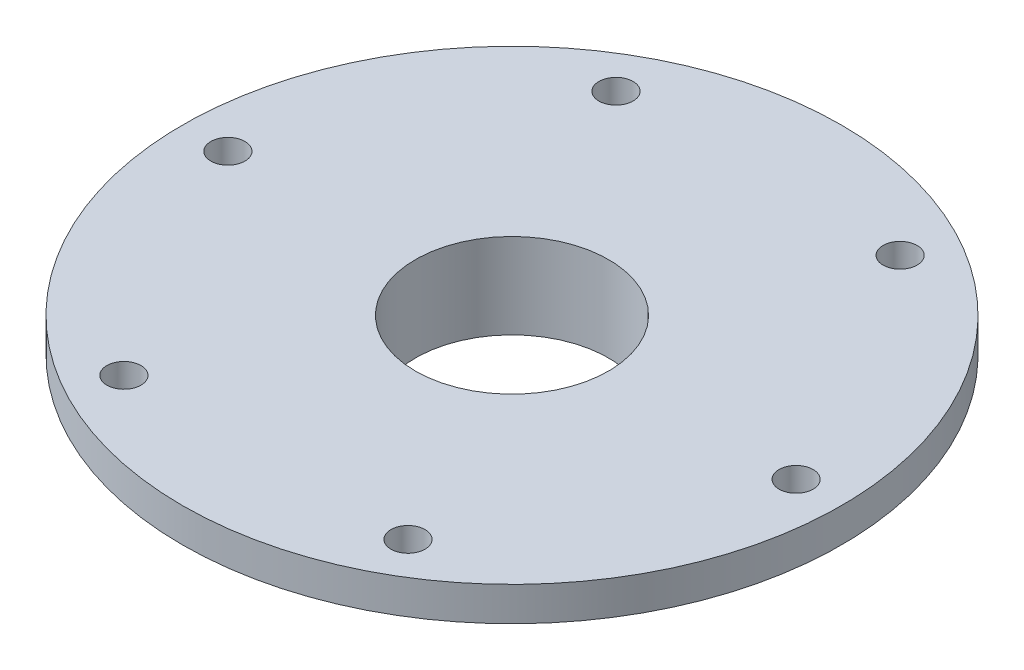
ISO-10303-21;
HEADER;
FILE_DESCRIPTION(('STEP AP214'),'2;1');
FILE_NAME('part.step','',(''),(''),'','','');
FILE_SCHEMA(('AUTOMOTIVE_DESIGN { 1 0 10303 214 1 1 1 1 }'));
ENDSEC;
DATA;
#1=APPLICATION_CONTEXT('core data for automotive mechanical design processes');
#2=APPLICATION_PROTOCOL_DEFINITION('international standard','automotive_design',2000,#1);
#3=PRODUCT_CONTEXT('',#1,'mechanical');
#4=PRODUCT('Part','Part','',(#3));
#5=PRODUCT_RELATED_PRODUCT_CATEGORY('part','',(#4));
#6=PRODUCT_DEFINITION_FORMATION('','',#4);
#7=PRODUCT_DEFINITION_CONTEXT('part definition',#1,'design');
#8=PRODUCT_DEFINITION('design','',#6,#7);
#9=PRODUCT_DEFINITION_SHAPE('','',#8);
#10=(LENGTH_UNIT() NAMED_UNIT(*) SI_UNIT(.MILLI.,.METRE.));
#11=(NAMED_UNIT(*) PLANE_ANGLE_UNIT() SI_UNIT($,.RADIAN.));
#12=(NAMED_UNIT(*) SI_UNIT($,.STERADIAN.) SOLID_ANGLE_UNIT());
#13=UNCERTAINTY_MEASURE_WITH_UNIT(LENGTH_MEASURE(1.E-05),#10,'distance_accuracy_value','');
#14=(GEOMETRIC_REPRESENTATION_CONTEXT(3) GLOBAL_UNCERTAINTY_ASSIGNED_CONTEXT((#13)) GLOBAL_UNIT_ASSIGNED_CONTEXT((#10,
#11,#12)) REPRESENTATION_CONTEXT('',''));
#15=CARTESIAN_POINT('',(0.,0.,0.));
#16=DIRECTION('',(0.,0.,1.));
#17=DIRECTION('',(1.,0.,0.));
#18=AXIS2_PLACEMENT_3D('',#15,#16,#17);
#19=CARTESIAN_POINT('',(0.,27.2792430533376,0.));
#20=DIRECTION('',(0.,1.,0.));
#21=DIRECTION('',(0.,0.,1.));
#22=AXIS2_PLACEMENT_3D('',#19,#20,#21);
#23=CYLINDRICAL_SURFACE('',#22,8.5);
#24=CARTESIAN_POINT('',(0.,0.,0.));
#25=DIRECTION('',(0.,1.,0.));
#26=DIRECTION('',(0.,0.,1.));
#27=AXIS2_PLACEMENT_3D('',#24,#25,#26);
#28=CIRCLE('',#27,8.5);
#29=CARTESIAN_POINT('',(0.,0.,8.5));
#30=VERTEX_POINT('',#29);
#31=EDGE_CURVE('E10',#30,#30,#28,.T.);
#32=ORIENTED_EDGE('',*,*,#31,.T.);
#33=EDGE_LOOP('',(#32));
#34=FACE_BOUND('',#33,.T.);
#35=CARTESIAN_POINT('',(0.,-7.5,0.));
#36=DIRECTION('',(0.,1.,0.));
#37=DIRECTION('',(0.,0.,1.));
#38=AXIS2_PLACEMENT_3D('',#35,#36,#37);
#39=CIRCLE('',#38,8.49999999999999);
#40=CARTESIAN_POINT('',(0.,-7.5,8.49999999999999));
#41=VERTEX_POINT('',#40);
#42=EDGE_CURVE('E67',#41,#41,#39,.T.);
#43=ORIENTED_EDGE('',*,*,#42,.F.);
#44=EDGE_LOOP('',(#43));
#45=FACE_BOUND('',#44,.T.);
#46=ADVANCED_FACE('F34',(#34,#45),#23,.F.);
#47=CARTESIAN_POINT('',(-8.5,0.,0.));
#48=DIRECTION('',(0.,1.,0.));
#49=DIRECTION('',(0.,0.,1.));
#50=AXIS2_PLACEMENT_3D('',#47,#48,#49);
#51=PLANE('',#50);
#52=CARTESIAN_POINT('',(-25.,0.,0.));
#53=DIRECTION('',(0.,1.,0.));
#54=DIRECTION('',(0.,0.,1.));
#55=AXIS2_PLACEMENT_3D('',#52,#53,#54);
#56=CIRCLE('',#55,1.5);
#57=CARTESIAN_POINT('',(-25.,0.,1.5));
#58=VERTEX_POINT('',#57);
#59=EDGE_CURVE('E54',#58,#58,#56,.T.);
#60=ORIENTED_EDGE('',*,*,#59,.F.);
#61=EDGE_LOOP('',(#60));
#62=FACE_BOUND('',#61,.T.);
#63=CARTESIAN_POINT('',(-12.5,0.,21.650635094611));
#64=DIRECTION('',(0.,1.,0.));
#65=DIRECTION('',(0.,0.,1.));
#66=AXIS2_PLACEMENT_3D('',#63,#64,#65);
#67=CIRCLE('',#66,1.5);
#68=CARTESIAN_POINT('',(-12.5,0.,23.150635094611));
#69=VERTEX_POINT('',#68);
#70=EDGE_CURVE('E118',#69,#69,#67,.T.);
#71=ORIENTED_EDGE('',*,*,#70,.F.);
#72=EDGE_LOOP('',(#71));
#73=FACE_BOUND('',#72,.T.);
#74=CARTESIAN_POINT('',(12.5,0.,21.650635094611));
#75=DIRECTION('',(0.,1.,0.));
#76=DIRECTION('',(0.,0.,1.));
#77=AXIS2_PLACEMENT_3D('',#74,#75,#76);
#78=CIRCLE('',#77,1.5);
#79=CARTESIAN_POINT('',(12.5,0.,23.150635094611));
#80=VERTEX_POINT('',#79);
#81=EDGE_CURVE('E79',#80,#80,#78,.T.);
#82=ORIENTED_EDGE('',*,*,#81,.F.);
#83=EDGE_LOOP('',(#82));
#84=FACE_BOUND('',#83,.T.);
#85=CARTESIAN_POINT('',(25.,0.,0.));
#86=DIRECTION('',(0.,1.,0.));
#87=DIRECTION('',(0.,0.,1.));
#88=AXIS2_PLACEMENT_3D('',#85,#86,#87);
#89=CIRCLE('',#88,1.5);
#90=CARTESIAN_POINT('',(25.,0.,1.5));
#91=VERTEX_POINT('',#90);
#92=EDGE_CURVE('E125',#91,#91,#89,.T.);
#93=ORIENTED_EDGE('',*,*,#92,.F.);
#94=EDGE_LOOP('',(#93));
#95=FACE_BOUND('',#94,.T.);
#96=CARTESIAN_POINT('',(12.5,0.,-21.650635094611));
#97=DIRECTION('',(0.,1.,0.));
#98=DIRECTION('',(0.,0.,1.));
#99=AXIS2_PLACEMENT_3D('',#96,#97,#98);
#100=CIRCLE('',#99,1.5);
#101=CARTESIAN_POINT('',(12.5,0.,-20.150635094611));
#102=VERTEX_POINT('',#101);
#103=EDGE_CURVE('E129',#102,#102,#100,.T.);
#104=ORIENTED_EDGE('',*,*,#103,.F.);
#105=EDGE_LOOP('',(#104));
#106=FACE_BOUND('',#105,.T.);
#107=CARTESIAN_POINT('',(-12.5,0.,-21.650635094611));
#108=DIRECTION('',(0.,1.,0.));
#109=DIRECTION('',(0.,0.,1.));
#110=AXIS2_PLACEMENT_3D('',#107,#108,#109);
#111=CIRCLE('',#110,1.5);
#112=CARTESIAN_POINT('',(-12.5,0.,-20.150635094611));
#113=VERTEX_POINT('',#112);
#114=EDGE_CURVE('E133',#113,#113,#111,.T.);
#115=ORIENTED_EDGE('',*,*,#114,.F.);
#116=EDGE_LOOP('',(#115));
#117=FACE_BOUND('',#116,.T.);
#118=CARTESIAN_POINT('',(0.,0.,0.));
#119=DIRECTION('',(0.,1.,0.));
#120=DIRECTION('',(0.,0.,1.));
#121=AXIS2_PLACEMENT_3D('',#118,#119,#120);
#122=CIRCLE('',#121,29.);
#123=CARTESIAN_POINT('',(0.,0.,29.));
#124=VERTEX_POINT('',#123);
#125=EDGE_CURVE('E41',#124,#124,#122,.T.);
#126=ORIENTED_EDGE('',*,*,#125,.T.);
#127=EDGE_LOOP('',(#126));
#128=FACE_BOUND('',#127,.T.);
#129=ORIENTED_EDGE('',*,*,#31,.F.);
#130=EDGE_LOOP('',(#129));
#131=FACE_BOUND('',#130,.T.);
#132=ADVANCED_FACE('F101',(#62,#73,#84,#95,#106,#117,#128,#131),#51,.T.);
#133=CARTESIAN_POINT('',(0.,27.2792430533376,0.));
#134=DIRECTION('',(0.,1.,0.));
#135=DIRECTION('',(0.,0.,1.));
#136=AXIS2_PLACEMENT_3D('',#133,#134,#135);
#137=CYLINDRICAL_SURFACE('',#136,29.);
#138=CARTESIAN_POINT('',(0.,-3.,0.));
#139=DIRECTION('',(0.,1.,0.));
#140=DIRECTION('',(0.,0.,1.));
#141=AXIS2_PLACEMENT_3D('',#138,#139,#140);
#142=CIRCLE('',#141,29.);
#143=CARTESIAN_POINT('',(0.,-3.,29.));
#144=VERTEX_POINT('',#143);
#145=EDGE_CURVE('E46',#144,#144,#142,.T.);
#146=ORIENTED_EDGE('',*,*,#145,.T.);
#147=EDGE_LOOP('',(#146));
#148=FACE_BOUND('',#147,.T.);
#149=ORIENTED_EDGE('',*,*,#125,.F.);
#150=EDGE_LOOP('',(#149));
#151=FACE_BOUND('',#150,.T.);
#152=ADVANCED_FACE('F86',(#148,#151),#137,.T.);
#153=CARTESIAN_POINT('',(-29.,-3.,0.));
#154=DIRECTION('',(0.,-1.,0.));
#155=DIRECTION('',(0.,0.,-1.));
#156=AXIS2_PLACEMENT_3D('',#153,#154,#155);
#157=PLANE('',#156);
#158=CARTESIAN_POINT('',(-25.,-3.,0.));
#159=DIRECTION('',(0.,-1.,0.));
#160=DIRECTION('',(0.,0.,-1.));
#161=AXIS2_PLACEMENT_3D('',#158,#159,#160);
#162=CIRCLE('',#161,1.5);
#163=CARTESIAN_POINT('',(-25.,-3.,-1.5));
#164=VERTEX_POINT('',#163);
#165=EDGE_CURVE('E37',#164,#164,#162,.T.);
#166=ORIENTED_EDGE('',*,*,#165,.F.);
#167=EDGE_LOOP('',(#166));
#168=FACE_BOUND('',#167,.T.);
#169=CARTESIAN_POINT('',(-12.5,-3.,21.650635094611));
#170=DIRECTION('',(0.,-1.,0.));
#171=DIRECTION('',(0.,0.,-1.));
#172=AXIS2_PLACEMENT_3D('',#169,#170,#171);
#173=CIRCLE('',#172,1.5);
#174=CARTESIAN_POINT('',(-12.5,-3.,20.150635094611));
#175=VERTEX_POINT('',#174);
#176=EDGE_CURVE('E62',#175,#175,#173,.T.);
#177=ORIENTED_EDGE('',*,*,#176,.F.);
#178=EDGE_LOOP('',(#177));
#179=FACE_BOUND('',#178,.T.);
#180=CARTESIAN_POINT('',(12.5,-3.,21.650635094611));
#181=DIRECTION('',(0.,-1.,0.));
#182=DIRECTION('',(0.,0.,-1.));
#183=AXIS2_PLACEMENT_3D('',#180,#181,#182);
#184=CIRCLE('',#183,1.5);
#185=CARTESIAN_POINT('',(12.5,-3.,20.150635094611));
#186=VERTEX_POINT('',#185);
#187=EDGE_CURVE('E60',#186,#186,#184,.T.);
#188=ORIENTED_EDGE('',*,*,#187,.F.);
#189=EDGE_LOOP('',(#188));
#190=FACE_BOUND('',#189,.T.);
#191=CARTESIAN_POINT('',(25.,-3.,0.));
#192=DIRECTION('',(0.,-1.,0.));
#193=DIRECTION('',(0.,0.,-1.));
#194=AXIS2_PLACEMENT_3D('',#191,#192,#193);
#195=CIRCLE('',#194,1.5);
#196=CARTESIAN_POINT('',(25.,-3.,-1.5));
#197=VERTEX_POINT('',#196);
#198=EDGE_CURVE('E57',#197,#197,#195,.T.);
#199=ORIENTED_EDGE('',*,*,#198,.F.);
#200=EDGE_LOOP('',(#199));
#201=FACE_BOUND('',#200,.T.);
#202=CARTESIAN_POINT('',(12.5,-3.,-21.650635094611));
#203=DIRECTION('',(0.,-1.,0.));
#204=DIRECTION('',(0.,0.,-1.));
#205=AXIS2_PLACEMENT_3D('',#202,#203,#204);
#206=CIRCLE('',#205,1.5);
#207=CARTESIAN_POINT('',(12.5,-3.,-23.150635094611));
#208=VERTEX_POINT('',#207);
#209=EDGE_CURVE('E53',#208,#208,#206,.T.);
#210=ORIENTED_EDGE('',*,*,#209,.F.);
#211=EDGE_LOOP('',(#210));
#212=FACE_BOUND('',#211,.T.);
#213=CARTESIAN_POINT('',(-12.5,-3.,-21.650635094611));
#214=DIRECTION('',(0.,-1.,0.));
#215=DIRECTION('',(0.,0.,-1.));
#216=AXIS2_PLACEMENT_3D('',#213,#214,#215);
#217=CIRCLE('',#216,1.5);
#218=CARTESIAN_POINT('',(-12.5,-3.,-23.150635094611));
#219=VERTEX_POINT('',#218);
#220=EDGE_CURVE('E50',#219,#219,#217,.T.);
#221=ORIENTED_EDGE('',*,*,#220,.F.);
#222=EDGE_LOOP('',(#221));
#223=FACE_BOUND('',#222,.T.);
#224=CARTESIAN_POINT('',(0.,-3.,0.));
#225=DIRECTION('',(0.,1.,0.));
#226=DIRECTION('',(0.,0.,1.));
#227=AXIS2_PLACEMENT_3D('',#224,#225,#226);
#228=CIRCLE('',#227,11.75);
#229=CARTESIAN_POINT('',(0.,-3.,11.75));
#230=VERTEX_POINT('',#229);
#231=EDGE_CURVE('E76',#230,#230,#228,.T.);
#232=ORIENTED_EDGE('',*,*,#231,.T.);
#233=EDGE_LOOP('',(#232));
#234=FACE_BOUND('',#233,.T.);
#235=ORIENTED_EDGE('',*,*,#145,.F.);
#236=EDGE_LOOP('',(#235));
#237=FACE_BOUND('',#236,.T.);
#238=ADVANCED_FACE('F89',(#168,#179,#190,#201,#212,#223,#234,#237),#157,.T.);
#239=CARTESIAN_POINT('',(0.,27.2792430533376,0.));
#240=DIRECTION('',(0.,1.,0.));
#241=DIRECTION('',(0.,0.,1.));
#242=AXIS2_PLACEMENT_3D('',#239,#240,#241);
#243=CYLINDRICAL_SURFACE('',#242,11.75);
#244=CARTESIAN_POINT('',(0.,-7.5,0.));
#245=DIRECTION('',(0.,1.,0.));
#246=DIRECTION('',(0.,0.,1.));
#247=AXIS2_PLACEMENT_3D('',#244,#245,#246);
#248=CIRCLE('',#247,11.75);
#249=CARTESIAN_POINT('',(0.,-7.5,11.75));
#250=VERTEX_POINT('',#249);
#251=EDGE_CURVE('E71',#250,#250,#248,.T.);
#252=ORIENTED_EDGE('',*,*,#251,.T.);
#253=EDGE_LOOP('',(#252));
#254=FACE_BOUND('',#253,.T.);
#255=ORIENTED_EDGE('',*,*,#231,.F.);
#256=EDGE_LOOP('',(#255));
#257=FACE_BOUND('',#256,.T.);
#258=ADVANCED_FACE('F91',(#254,#257),#243,.T.);
#259=CARTESIAN_POINT('',(-11.75,-7.5,0.));
#260=DIRECTION('',(0.,-1.,0.));
#261=DIRECTION('',(0.,0.,-1.));
#262=AXIS2_PLACEMENT_3D('',#259,#260,#261);
#263=PLANE('',#262);
#264=ORIENTED_EDGE('',*,*,#42,.T.);
#265=EDGE_LOOP('',(#264));
#266=FACE_BOUND('',#265,.T.);
#267=ORIENTED_EDGE('',*,*,#251,.F.);
#268=EDGE_LOOP('',(#267));
#269=FACE_BOUND('',#268,.T.);
#270=ADVANCED_FACE('F98',(#266,#269),#263,.T.);
#271=CARTESIAN_POINT('',(-12.5,-7.5,-21.650635094611));
#272=DIRECTION('',(0.,1.,0.));
#273=DIRECTION('',(0.,0.,1.));
#274=AXIS2_PLACEMENT_3D('',#271,#272,#273);
#275=CYLINDRICAL_SURFACE('',#274,1.5);
#276=ORIENTED_EDGE('',*,*,#220,.T.);
#277=EDGE_LOOP('',(#276));
#278=FACE_BOUND('',#277,.T.);
#279=ORIENTED_EDGE('',*,*,#114,.T.);
#280=EDGE_LOOP('',(#279));
#281=FACE_BOUND('',#280,.T.);
#282=ADVANCED_FACE('F158',(#278,#281),#275,.F.);
#283=CARTESIAN_POINT('',(12.5,-7.5,-21.650635094611));
#284=DIRECTION('',(0.,1.,0.));
#285=DIRECTION('',(0.,0.,1.));
#286=AXIS2_PLACEMENT_3D('',#283,#284,#285);
#287=CYLINDRICAL_SURFACE('',#286,1.5);
#288=ORIENTED_EDGE('',*,*,#209,.T.);
#289=EDGE_LOOP('',(#288));
#290=FACE_BOUND('',#289,.T.);
#291=ORIENTED_EDGE('',*,*,#103,.T.);
#292=EDGE_LOOP('',(#291));
#293=FACE_BOUND('',#292,.T.);
#294=ADVANCED_FACE('F161',(#290,#293),#287,.F.);
#295=CARTESIAN_POINT('',(25.,-7.5,0.));
#296=DIRECTION('',(0.,1.,0.));
#297=DIRECTION('',(0.,0.,1.));
#298=AXIS2_PLACEMENT_3D('',#295,#296,#297);
#299=CYLINDRICAL_SURFACE('',#298,1.5);
#300=ORIENTED_EDGE('',*,*,#198,.T.);
#301=EDGE_LOOP('',(#300));
#302=FACE_BOUND('',#301,.T.);
#303=ORIENTED_EDGE('',*,*,#92,.T.);
#304=EDGE_LOOP('',(#303));
#305=FACE_BOUND('',#304,.T.);
#306=ADVANCED_FACE('F154',(#302,#305),#299,.F.);
#307=CARTESIAN_POINT('',(12.5,-7.5,21.650635094611));
#308=DIRECTION('',(0.,1.,0.));
#309=DIRECTION('',(0.,0.,1.));
#310=AXIS2_PLACEMENT_3D('',#307,#308,#309);
#311=CYLINDRICAL_SURFACE('',#310,1.5);
#312=ORIENTED_EDGE('',*,*,#187,.T.);
#313=EDGE_LOOP('',(#312));
#314=FACE_BOUND('',#313,.T.);
#315=ORIENTED_EDGE('',*,*,#81,.T.);
#316=EDGE_LOOP('',(#315));
#317=FACE_BOUND('',#316,.T.);
#318=ADVANCED_FACE('F147',(#314,#317),#311,.F.);
#319=CARTESIAN_POINT('',(-12.5,-7.5,21.650635094611));
#320=DIRECTION('',(0.,1.,0.));
#321=DIRECTION('',(0.,0.,1.));
#322=AXIS2_PLACEMENT_3D('',#319,#320,#321);
#323=CYLINDRICAL_SURFACE('',#322,1.5);
#324=ORIENTED_EDGE('',*,*,#176,.T.);
#325=EDGE_LOOP('',(#324));
#326=FACE_BOUND('',#325,.T.);
#327=ORIENTED_EDGE('',*,*,#70,.T.);
#328=EDGE_LOOP('',(#327));
#329=FACE_BOUND('',#328,.T.);
#330=ADVANCED_FACE('F144',(#326,#329),#323,.F.);
#331=CARTESIAN_POINT('',(-25.,-7.5,0.));
#332=DIRECTION('',(0.,1.,0.));
#333=DIRECTION('',(0.,0.,1.));
#334=AXIS2_PLACEMENT_3D('',#331,#332,#333);
#335=CYLINDRICAL_SURFACE('',#334,1.5);
#336=ORIENTED_EDGE('',*,*,#165,.T.);
#337=EDGE_LOOP('',(#336));
#338=FACE_BOUND('',#337,.T.);
#339=ORIENTED_EDGE('',*,*,#59,.T.);
#340=EDGE_LOOP('',(#339));
#341=FACE_BOUND('',#340,.T.);
#342=ADVANCED_FACE('F146',(#338,#341),#335,.F.);
#343=CLOSED_SHELL('',(#46,#132,#152,#238,#258,#270,#282,#294,#306,#318,#330,#342));
#344=MANIFOLD_SOLID_BREP('B2',#343);
#345=ADVANCED_BREP_SHAPE_REPRESENTATION('',(#18,#344),#14);
#346=SHAPE_DEFINITION_REPRESENTATION(#9,#345);
ENDSEC;
END-ISO-10303-21;
